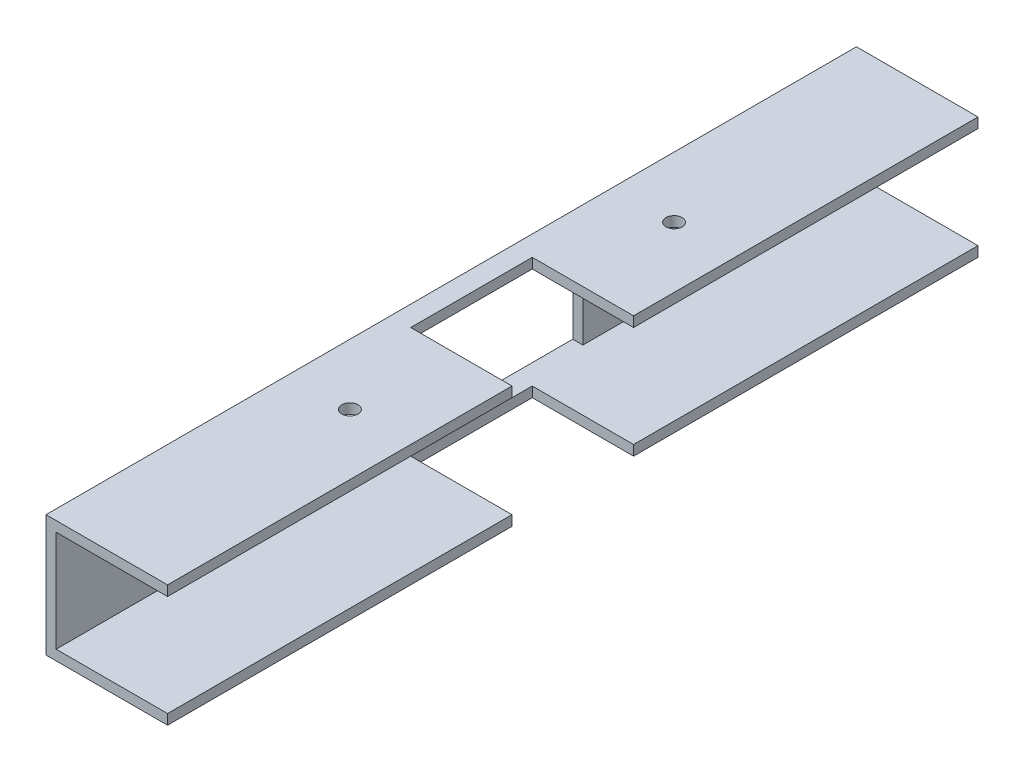
ISO-10303-21;
HEADER;
FILE_DESCRIPTION(('STEP AP214'),'2;1');
FILE_NAME('part.step','',(''),(''),'','','');
FILE_SCHEMA(('AUTOMOTIVE_DESIGN { 1 0 10303 214 1 1 1 1 }'));
ENDSEC;
DATA;
#1=APPLICATION_CONTEXT('core data for automotive mechanical design processes');
#2=APPLICATION_PROTOCOL_DEFINITION('international standard','automotive_design',2000,#1);
#3=PRODUCT_CONTEXT('',#1,'mechanical');
#4=PRODUCT('Part','Part','',(#3));
#5=PRODUCT_RELATED_PRODUCT_CATEGORY('part','',(#4));
#6=PRODUCT_DEFINITION_FORMATION('','',#4);
#7=PRODUCT_DEFINITION_CONTEXT('part definition',#1,'design');
#8=PRODUCT_DEFINITION('design','',#6,#7);
#9=PRODUCT_DEFINITION_SHAPE('','',#8);
#10=(LENGTH_UNIT() NAMED_UNIT(*) SI_UNIT(.MILLI.,.METRE.));
#11=(NAMED_UNIT(*) PLANE_ANGLE_UNIT() SI_UNIT($,.RADIAN.));
#12=(NAMED_UNIT(*) SI_UNIT($,.STERADIAN.) SOLID_ANGLE_UNIT());
#13=UNCERTAINTY_MEASURE_WITH_UNIT(LENGTH_MEASURE(1.E-05),#10,'distance_accuracy_value','');
#14=(GEOMETRIC_REPRESENTATION_CONTEXT(3) GLOBAL_UNCERTAINTY_ASSIGNED_CONTEXT((#13)) GLOBAL_UNIT_ASSIGNED_CONTEXT((#10,
#11,#12)) REPRESENTATION_CONTEXT('',''));
#15=CARTESIAN_POINT('',(0.,0.,0.));
#16=DIRECTION('',(0.,0.,1.));
#17=DIRECTION('',(1.,0.,0.));
#18=AXIS2_PLACEMENT_3D('',#15,#16,#17);
#19=CARTESIAN_POINT('',(19.05,15.875,127.));
#20=DIRECTION('',(0.,-1.,0.));
#21=DIRECTION('',(1.,0.,0.));
#22=AXIS2_PLACEMENT_3D('',#19,#20,#21);
#23=PLANE('',#22);
#24=DIRECTION('',(0.,0.,-1.));
#25=VECTOR('',#24,1.);
#26=CARTESIAN_POINT('',(-15.875,15.875,127.));
#27=LINE('',#26,#25);
#28=CARTESIAN_POINT('',(-15.875,15.875,127.));
#29=VERTEX_POINT('',#28);
#30=CARTESIAN_POINT('',(-15.875,15.875,38.1));
#31=VERTEX_POINT('',#30);
#32=EDGE_CURVE('E302',#29,#31,#27,.T.);
#33=ORIENTED_EDGE('',*,*,#32,.T.);
#34=DIRECTION('',(-1.,0.,0.));
#35=VECTOR('',#34,1.);
#36=CARTESIAN_POINT('',(19.05,15.875,38.1));
#37=LINE('',#36,#35);
#38=CARTESIAN_POINT('',(-19.05,15.875,38.1));
#39=VERTEX_POINT('',#38);
#40=EDGE_CURVE('E176',#31,#39,#37,.T.);
#41=ORIENTED_EDGE('',*,*,#40,.T.);
#42=DIRECTION('',(0.,0.,-1.));
#43=VECTOR('',#42,1.);
#44=CARTESIAN_POINT('',(-19.05,15.875,-38.1));
#45=LINE('',#44,#43);
#46=CARTESIAN_POINT('',(-19.05,15.875,-38.1));
#47=VERTEX_POINT('',#46);
#48=EDGE_CURVE('E188',#39,#47,#45,.T.);
#49=ORIENTED_EDGE('',*,*,#48,.T.);
#50=DIRECTION('',(-1.,0.,0.));
#51=VECTOR('',#50,1.);
#52=CARTESIAN_POINT('',(19.05,15.875,-38.1));
#53=LINE('',#52,#51);
#54=CARTESIAN_POINT('',(-15.875,15.875,-38.1));
#55=VERTEX_POINT('',#54);
#56=EDGE_CURVE('E193',#55,#47,#53,.T.);
#57=ORIENTED_EDGE('',*,*,#56,.F.);
#58=CARTESIAN_POINT('',(-15.875,15.875,-127.));
#59=VERTEX_POINT('',#58);
#60=EDGE_CURVE('E301',#55,#59,#27,.T.);
#61=ORIENTED_EDGE('',*,*,#60,.T.);
#62=DIRECTION('',(-1.,0.,0.));
#63=VECTOR('',#62,1.);
#64=CARTESIAN_POINT('',(19.05,15.875,-127.));
#65=LINE('',#64,#63);
#66=CARTESIAN_POINT('',(19.05,15.875,-127.));
#67=VERTEX_POINT('',#66);
#68=EDGE_CURVE('E280',#67,#59,#65,.T.);
#69=ORIENTED_EDGE('',*,*,#68,.F.);
#70=DIRECTION('',(0.,0.,-1.));
#71=VECTOR('',#70,1.);
#72=CARTESIAN_POINT('',(19.05,15.875,127.));
#73=LINE('',#72,#71);
#74=CARTESIAN_POINT('',(19.05,15.875,-19.05));
#75=VERTEX_POINT('',#74);
#76=EDGE_CURVE('E298',#75,#67,#73,.T.);
#77=ORIENTED_EDGE('',*,*,#76,.F.);
#78=DIRECTION('',(1.,0.,0.));
#79=VECTOR('',#78,1.);
#80=CARTESIAN_POINT('',(19.05,15.875,-19.05));
#81=LINE('',#80,#79);
#82=CARTESIAN_POINT('',(-12.7,15.875,-19.05));
#83=VERTEX_POINT('',#82);
#84=EDGE_CURVE('E221',#83,#75,#81,.T.);
#85=ORIENTED_EDGE('',*,*,#84,.F.);
#86=DIRECTION('',(0.,0.,-1.));
#87=VECTOR('',#86,1.);
#88=CARTESIAN_POINT('',(-12.7,15.875,127.));
#89=LINE('',#88,#87);
#90=CARTESIAN_POINT('',(-12.7,15.875,19.05));
#91=VERTEX_POINT('',#90);
#92=EDGE_CURVE('E236',#91,#83,#89,.T.);
#93=ORIENTED_EDGE('',*,*,#92,.F.);
#94=DIRECTION('',(-1.,0.,0.));
#95=VECTOR('',#94,1.);
#96=CARTESIAN_POINT('',(19.0499999999999,15.875,19.05));
#97=LINE('',#96,#95);
#98=CARTESIAN_POINT('',(19.05,15.875,19.05));
#99=VERTEX_POINT('',#98);
#100=EDGE_CURVE('E240',#99,#91,#97,.T.);
#101=ORIENTED_EDGE('',*,*,#100,.F.);
#102=CARTESIAN_POINT('',(19.05,15.875,127.));
#103=VERTEX_POINT('',#102);
#104=EDGE_CURVE('E299',#103,#99,#73,.T.);
#105=ORIENTED_EDGE('',*,*,#104,.F.);
#106=DIRECTION('',(-1.,0.,0.));
#107=VECTOR('',#106,1.);
#108=CARTESIAN_POINT('',(19.05,15.875,127.));
#109=LINE('',#108,#107);
#110=EDGE_CURVE('E258',#103,#29,#109,.T.);
#111=ORIENTED_EDGE('',*,*,#110,.T.);
#112=EDGE_LOOP('',(#33,#41,#49,#57,#61,#69,#77,#85,#93,#101,#105,#111));
#113=FACE_BOUND('',#112,.T.);
#114=CARTESIAN_POINT('',(0.,15.875,50.8));
#115=DIRECTION('',(0.,-1.,0.));
#116=DIRECTION('',(1.,0.,0.));
#117=AXIS2_PLACEMENT_3D('',#114,#115,#116);
#118=CIRCLE('',#117,2.54);
#119=CARTESIAN_POINT('',(2.54,15.875,50.8));
#120=VERTEX_POINT('',#119);
#121=EDGE_CURVE('E334',#120,#120,#118,.F.);
#122=ORIENTED_EDGE('',*,*,#121,.T.);
#123=EDGE_LOOP('',(#122));
#124=FACE_BOUND('',#123,.T.);
#125=CARTESIAN_POINT('',(0.,15.875,-50.8));
#126=DIRECTION('',(0.,-1.,0.));
#127=DIRECTION('',(1.,0.,0.));
#128=AXIS2_PLACEMENT_3D('',#125,#126,#127);
#129=CIRCLE('',#128,2.54);
#130=CARTESIAN_POINT('',(2.54,15.875,-50.8));
#131=VERTEX_POINT('',#130);
#132=EDGE_CURVE('E342',#131,#131,#129,.T.);
#133=ORIENTED_EDGE('',*,*,#132,.F.);
#134=EDGE_LOOP('',(#133));
#135=FACE_BOUND('',#134,.T.);
#136=ADVANCED_FACE('F33',(#113,#124,#135),#23,.T.);
#137=CARTESIAN_POINT('',(19.05,19.05,127.));
#138=DIRECTION('',(0.,-1.,0.));
#139=DIRECTION('',(1.,0.,0.));
#140=AXIS2_PLACEMENT_3D('',#137,#138,#139);
#141=PLANE('',#140);
#142=DIRECTION('',(0.,0.,-1.));
#143=VECTOR('',#142,1.);
#144=CARTESIAN_POINT('',(19.05,19.05,127.));
#145=LINE('',#144,#143);
#146=CARTESIAN_POINT('',(19.05,19.05,127.));
#147=VERTEX_POINT('',#146);
#148=CARTESIAN_POINT('',(19.05,19.05,19.05));
#149=VERTEX_POINT('',#148);
#150=EDGE_CURVE('E295',#147,#149,#145,.T.);
#151=ORIENTED_EDGE('',*,*,#150,.T.);
#152=DIRECTION('',(1.,0.,0.));
#153=VECTOR('',#152,1.);
#154=CARTESIAN_POINT('',(19.05,19.05,19.05));
#155=LINE('',#154,#153);
#156=CARTESIAN_POINT('',(-12.7,19.05,19.05));
#157=VERTEX_POINT('',#156);
#158=EDGE_CURVE('E205',#157,#149,#155,.T.);
#159=ORIENTED_EDGE('',*,*,#158,.F.);
#160=DIRECTION('',(0.,0.,1.));
#161=VECTOR('',#160,1.);
#162=CARTESIAN_POINT('',(-12.7,19.05,-19.05));
#163=LINE('',#162,#161);
#164=CARTESIAN_POINT('',(-12.7,19.05,-19.05));
#165=VERTEX_POINT('',#164);
#166=EDGE_CURVE('E214',#165,#157,#163,.T.);
#167=ORIENTED_EDGE('',*,*,#166,.F.);
#168=DIRECTION('',(-1.,0.,0.));
#169=VECTOR('',#168,1.);
#170=CARTESIAN_POINT('',(19.05,19.05,-19.05));
#171=LINE('',#170,#169);
#172=CARTESIAN_POINT('',(19.05,19.05,-19.05));
#173=VERTEX_POINT('',#172);
#174=EDGE_CURVE('E200',#173,#165,#171,.T.);
#175=ORIENTED_EDGE('',*,*,#174,.F.);
#176=CARTESIAN_POINT('',(19.05,19.05,-127.));
#177=VERTEX_POINT('',#176);
#178=EDGE_CURVE('E294',#173,#177,#145,.T.);
#179=ORIENTED_EDGE('',*,*,#178,.T.);
#180=DIRECTION('',(-1.,0.,0.));
#181=VECTOR('',#180,1.);
#182=CARTESIAN_POINT('',(19.05,19.05,-127.));
#183=LINE('',#182,#181);
#184=CARTESIAN_POINT('',(-19.05,19.05,-127.));
#185=VERTEX_POINT('',#184);
#186=EDGE_CURVE('E286',#177,#185,#183,.T.);
#187=ORIENTED_EDGE('',*,*,#186,.T.);
#188=DIRECTION('',(0.,0.,-1.));
#189=VECTOR('',#188,1.);
#190=CARTESIAN_POINT('',(-19.05,19.05,127.));
#191=LINE('',#190,#189);
#192=CARTESIAN_POINT('',(-19.05,19.05,127.));
#193=VERTEX_POINT('',#192);
#194=EDGE_CURVE('E291',#193,#185,#191,.T.);
#195=ORIENTED_EDGE('',*,*,#194,.F.);
#196=DIRECTION('',(-1.,0.,0.));
#197=VECTOR('',#196,1.);
#198=CARTESIAN_POINT('',(19.05,19.05,127.));
#199=LINE('',#198,#197);
#200=EDGE_CURVE('E264',#147,#193,#199,.T.);
#201=ORIENTED_EDGE('',*,*,#200,.F.);
#202=EDGE_LOOP('',(#151,#159,#167,#175,#179,#187,#195,#201));
#203=FACE_BOUND('',#202,.T.);
#204=CARTESIAN_POINT('',(0.,19.05,50.8));
#205=DIRECTION('',(0.,1.,0.));
#206=DIRECTION('',(-1.,0.,0.));
#207=AXIS2_PLACEMENT_3D('',#204,#205,#206);
#208=CIRCLE('',#207,2.54);
#209=CARTESIAN_POINT('',(-2.54,19.05,50.8));
#210=VERTEX_POINT('',#209);
#211=EDGE_CURVE('E332',#210,#210,#208,.T.);
#212=ORIENTED_EDGE('',*,*,#211,.F.);
#213=EDGE_LOOP('',(#212));
#214=FACE_BOUND('',#213,.T.);
#215=CARTESIAN_POINT('',(0.,19.05,-50.8));
#216=DIRECTION('',(0.,-1.,0.));
#217=DIRECTION('',(-1.,0.,0.));
#218=AXIS2_PLACEMENT_3D('',#215,#216,#217);
#219=CIRCLE('',#218,2.54);
#220=CARTESIAN_POINT('',(-2.54,19.05,-50.8));
#221=VERTEX_POINT('',#220);
#222=EDGE_CURVE('E338',#221,#221,#219,.T.);
#223=ORIENTED_EDGE('',*,*,#222,.T.);
#224=EDGE_LOOP('',(#223));
#225=FACE_BOUND('',#224,.T.);
#226=ADVANCED_FACE('F350',(#203,#214,#225),#141,.F.);
#227=CARTESIAN_POINT('',(-15.875,15.875,127.));
#228=DIRECTION('',(1.,0.,0.));
#229=DIRECTION('',(0.,1.,0.));
#230=AXIS2_PLACEMENT_3D('',#227,#228,#229);
#231=PLANE('',#230);
#232=DIRECTION('',(0.,1.,0.));
#233=VECTOR('',#232,1.);
#234=CARTESIAN_POINT('',(-15.875,15.875,-38.1));
#235=LINE('',#234,#233);
#236=CARTESIAN_POINT('',(-15.875,-15.875,-38.1));
#237=VERTEX_POINT('',#236);
#238=EDGE_CURVE('E198',#237,#55,#235,.T.);
#239=ORIENTED_EDGE('',*,*,#238,.F.);
#240=DIRECTION('',(0.,0.,-1.));
#241=VECTOR('',#240,1.);
#242=CARTESIAN_POINT('',(-15.875,-15.875,127.));
#243=LINE('',#242,#241);
#244=CARTESIAN_POINT('',(-15.875,-15.875,-127.));
#245=VERTEX_POINT('',#244);
#246=EDGE_CURVE('E305',#237,#245,#243,.T.);
#247=ORIENTED_EDGE('',*,*,#246,.T.);
#248=DIRECTION('',(0.,-1.,0.));
#249=VECTOR('',#248,1.);
#250=CARTESIAN_POINT('',(-15.875,15.875,-127.));
#251=LINE('',#250,#249);
#252=EDGE_CURVE('E277',#59,#245,#251,.T.);
#253=ORIENTED_EDGE('',*,*,#252,.F.);
#254=ORIENTED_EDGE('',*,*,#60,.F.);
#255=EDGE_LOOP('',(#239,#247,#253,#254));
#256=FACE_BOUND('',#255,.T.);
#257=ADVANCED_FACE('F327',(#256),#231,.T.);
#258=CARTESIAN_POINT('',(19.05,-15.875,127.));
#259=DIRECTION('',(1.,0.,0.));
#260=DIRECTION('',(0.,0.,-1.));
#261=AXIS2_PLACEMENT_3D('',#258,#259,#260);
#262=PLANE('',#261);
#263=DIRECTION('',(0.,1.,0.));
#264=VECTOR('',#263,1.);
#265=CARTESIAN_POINT('',(19.05,-19.05,19.05));
#266=LINE('',#265,#264);
#267=CARTESIAN_POINT('',(19.05,-19.05,19.05));
#268=VERTEX_POINT('',#267);
#269=CARTESIAN_POINT('',(19.05,-15.875,19.05));
#270=VERTEX_POINT('',#269);
#271=EDGE_CURVE('E218',#268,#270,#266,.T.);
#272=ORIENTED_EDGE('',*,*,#271,.T.);
#273=DIRECTION('',(0.,0.,-1.));
#274=VECTOR('',#273,1.);
#275=CARTESIAN_POINT('',(19.05,-15.875,127.));
#276=LINE('',#275,#274);
#277=CARTESIAN_POINT('',(19.05,-15.875,127.));
#278=VERTEX_POINT('',#277);
#279=EDGE_CURVE('E308',#278,#270,#276,.T.);
#280=ORIENTED_EDGE('',*,*,#279,.F.);
#281=DIRECTION('',(0.,-1.,0.));
#282=VECTOR('',#281,1.);
#283=CARTESIAN_POINT('',(19.05,-15.875,127.));
#284=LINE('',#283,#282);
#285=CARTESIAN_POINT('',(19.05,-19.05,127.));
#286=VERTEX_POINT('',#285);
#287=EDGE_CURVE('E248',#278,#286,#284,.T.);
#288=ORIENTED_EDGE('',*,*,#287,.T.);
#289=DIRECTION('',(0.,0.,-1.));
#290=VECTOR('',#289,1.);
#291=CARTESIAN_POINT('',(19.05,-19.05,127.));
#292=LINE('',#291,#290);
#293=EDGE_CURVE('E11',#286,#268,#292,.T.);
#294=ORIENTED_EDGE('',*,*,#293,.T.);
#295=EDGE_LOOP('',(#272,#280,#288,#294));
#296=FACE_BOUND('',#295,.T.);
#297=ADVANCED_FACE('F367',(#296),#262,.T.);
#298=CARTESIAN_POINT('',(19.05,19.05,127.));
#299=DIRECTION('',(1.,0.,0.));
#300=DIRECTION('',(0.,0.,-1.));
#301=AXIS2_PLACEMENT_3D('',#298,#299,#300);
#302=PLANE('',#301);
#303=EDGE_CURVE('E222',#99,#149,#266,.T.);
#304=ORIENTED_EDGE('',*,*,#303,.T.);
#305=ORIENTED_EDGE('',*,*,#150,.F.);
#306=DIRECTION('',(0.,-1.,0.));
#307=VECTOR('',#306,1.);
#308=CARTESIAN_POINT('',(19.05,19.05,127.));
#309=LINE('',#308,#307);
#310=EDGE_CURVE('E261',#147,#103,#309,.T.);
#311=ORIENTED_EDGE('',*,*,#310,.T.);
#312=ORIENTED_EDGE('',*,*,#104,.T.);
#313=EDGE_LOOP('',(#304,#305,#311,#312));
#314=FACE_BOUND('',#313,.T.);
#315=ADVANCED_FACE('F373',(#314),#302,.T.);
#316=CARTESIAN_POINT('',(-19.05,-19.05,127.));
#317=DIRECTION('',(0.,1.,0.));
#318=DIRECTION('',(0.,0.,1.));
#319=AXIS2_PLACEMENT_3D('',#316,#317,#318);
#320=PLANE('',#319);
#321=DIRECTION('',(0.,0.,1.));
#322=VECTOR('',#321,1.);
#323=CARTESIAN_POINT('',(-12.7,-19.05,-19.05));
#324=LINE('',#323,#322);
#325=CARTESIAN_POINT('',(-12.7,-19.05,-19.05));
#326=VERTEX_POINT('',#325);
#327=CARTESIAN_POINT('',(-12.7,-19.05,19.05));
#328=VERTEX_POINT('',#327);
#329=EDGE_CURVE('E204',#326,#328,#324,.T.);
#330=ORIENTED_EDGE('',*,*,#329,.T.);
#331=DIRECTION('',(1.,0.,0.));
#332=VECTOR('',#331,1.);
#333=CARTESIAN_POINT('',(19.05,-19.05,19.05));
#334=LINE('',#333,#332);
#335=EDGE_CURVE('E208',#328,#268,#334,.T.);
#336=ORIENTED_EDGE('',*,*,#335,.T.);
#337=ORIENTED_EDGE('',*,*,#293,.F.);
#338=DIRECTION('',(1.,0.,0.));
#339=VECTOR('',#338,1.);
#340=CARTESIAN_POINT('',(-19.05,-19.05,127.));
#341=LINE('',#340,#339);
#342=CARTESIAN_POINT('',(-19.05,-19.05,127.));
#343=VERTEX_POINT('',#342);
#344=EDGE_CURVE('E246',#343,#286,#341,.T.);
#345=ORIENTED_EDGE('',*,*,#344,.F.);
#346=DIRECTION('',(0.,0.,-1.));
#347=VECTOR('',#346,1.);
#348=CARTESIAN_POINT('',(-19.05,-19.05,127.));
#349=LINE('',#348,#347);
#350=CARTESIAN_POINT('',(-19.05,-19.05,-127.));
#351=VERTEX_POINT('',#350);
#352=EDGE_CURVE('E268',#343,#351,#349,.T.);
#353=ORIENTED_EDGE('',*,*,#352,.T.);
#354=DIRECTION('',(1.,0.,0.));
#355=VECTOR('',#354,1.);
#356=CARTESIAN_POINT('',(-19.05,-19.05,-127.));
#357=LINE('',#356,#355);
#358=CARTESIAN_POINT('',(19.05,-19.05,-127.));
#359=VERTEX_POINT('',#358);
#360=EDGE_CURVE('E245',#351,#359,#357,.T.);
#361=ORIENTED_EDGE('',*,*,#360,.T.);
#362=CARTESIAN_POINT('',(19.05,-19.05,-19.05));
#363=VERTEX_POINT('',#362);
#364=EDGE_CURVE('E41',#363,#359,#292,.T.);
#365=ORIENTED_EDGE('',*,*,#364,.F.);
#366=DIRECTION('',(-1.,0.,0.));
#367=VECTOR('',#366,1.);
#368=CARTESIAN_POINT('',(19.05,-19.05,-19.05));
#369=LINE('',#368,#367);
#370=EDGE_CURVE('E201',#363,#326,#369,.T.);
#371=ORIENTED_EDGE('',*,*,#370,.T.);
#372=EDGE_LOOP('',(#330,#336,#337,#345,#353,#361,#365,#371));
#373=FACE_BOUND('',#372,.T.);
#374=ADVANCED_FACE('F35',(#373),#320,.F.);
#375=DIRECTION('',(0.,1.,0.));
#376=VECTOR('',#375,1.);
#377=CARTESIAN_POINT('',(19.05,-19.05,-19.05));
#378=LINE('',#377,#376);
#379=CARTESIAN_POINT('',(19.05,-15.875,-19.05));
#380=VERTEX_POINT('',#379);
#381=EDGE_CURVE('E231',#363,#380,#378,.T.);
#382=ORIENTED_EDGE('',*,*,#381,.F.);
#383=ORIENTED_EDGE('',*,*,#364,.T.);
#384=DIRECTION('',(0.,-1.,0.));
#385=VECTOR('',#384,1.);
#386=CARTESIAN_POINT('',(19.05,-15.875,-127.));
#387=LINE('',#386,#385);
#388=CARTESIAN_POINT('',(19.05,-15.875,-127.));
#389=VERTEX_POINT('',#388);
#390=EDGE_CURVE('E271',#389,#359,#387,.T.);
#391=ORIENTED_EDGE('',*,*,#390,.F.);
#392=EDGE_CURVE('E307',#380,#389,#276,.T.);
#393=ORIENTED_EDGE('',*,*,#392,.F.);
#394=EDGE_LOOP('',(#382,#383,#391,#393));
#395=FACE_BOUND('',#394,.T.);
#396=ADVANCED_FACE('F317',(#395),#262,.T.);
#397=CARTESIAN_POINT('',(-15.875,-15.875,127.));
#398=DIRECTION('',(0.,1.,0.));
#399=DIRECTION('',(0.,0.,1.));
#400=AXIS2_PLACEMENT_3D('',#397,#398,#399);
#401=PLANE('',#400);
#402=ORIENTED_EDGE('',*,*,#279,.T.);
#403=DIRECTION('',(1.,0.,0.));
#404=VECTOR('',#403,1.);
#405=CARTESIAN_POINT('',(-15.8750000000001,-15.875,19.05));
#406=LINE('',#405,#404);
#407=CARTESIAN_POINT('',(-12.7,-15.875,19.05));
#408=VERTEX_POINT('',#407);
#409=EDGE_CURVE('E242',#408,#270,#406,.T.);
#410=ORIENTED_EDGE('',*,*,#409,.F.);
#411=DIRECTION('',(0.,0.,1.));
#412=VECTOR('',#411,1.);
#413=CARTESIAN_POINT('',(-12.7,-15.875,127.));
#414=LINE('',#413,#412);
#415=CARTESIAN_POINT('',(-12.7,-15.875,-19.05));
#416=VERTEX_POINT('',#415);
#417=EDGE_CURVE('E238',#416,#408,#414,.T.);
#418=ORIENTED_EDGE('',*,*,#417,.F.);
#419=DIRECTION('',(-1.,0.,0.));
#420=VECTOR('',#419,1.);
#421=CARTESIAN_POINT('',(-15.875,-15.875,-19.05));
#422=LINE('',#421,#420);
#423=EDGE_CURVE('E234',#380,#416,#422,.T.);
#424=ORIENTED_EDGE('',*,*,#423,.F.);
#425=ORIENTED_EDGE('',*,*,#392,.T.);
#426=DIRECTION('',(1.,0.,0.));
#427=VECTOR('',#426,1.);
#428=CARTESIAN_POINT('',(-15.875,-15.875,-127.));
#429=LINE('',#428,#427);
#430=EDGE_CURVE('E274',#245,#389,#429,.T.);
#431=ORIENTED_EDGE('',*,*,#430,.F.);
#432=ORIENTED_EDGE('',*,*,#246,.F.);
#433=DIRECTION('',(-1.,0.,0.));
#434=VECTOR('',#433,1.);
#435=CARTESIAN_POINT('',(19.05,-15.875,-38.1));
#436=LINE('',#435,#434);
#437=CARTESIAN_POINT('',(-19.05,-15.875,-38.1));
#438=VERTEX_POINT('',#437);
#439=EDGE_CURVE('E177',#237,#438,#436,.T.);
#440=ORIENTED_EDGE('',*,*,#439,.T.);
#441=DIRECTION('',(0.,0.,1.));
#442=VECTOR('',#441,1.);
#443=CARTESIAN_POINT('',(-19.05,-15.875,-38.1));
#444=LINE('',#443,#442);
#445=CARTESIAN_POINT('',(-19.05,-15.875,38.1));
#446=VERTEX_POINT('',#445);
#447=EDGE_CURVE('E180',#438,#446,#444,.T.);
#448=ORIENTED_EDGE('',*,*,#447,.T.);
#449=DIRECTION('',(-1.,0.,0.));
#450=VECTOR('',#449,1.);
#451=CARTESIAN_POINT('',(19.05,-15.875,38.1));
#452=LINE('',#451,#450);
#453=CARTESIAN_POINT('',(-15.875,-15.875,38.1));
#454=VERTEX_POINT('',#453);
#455=EDGE_CURVE('E48',#454,#446,#452,.T.);
#456=ORIENTED_EDGE('',*,*,#455,.F.);
#457=CARTESIAN_POINT('',(-15.875,-15.875,127.));
#458=VERTEX_POINT('',#457);
#459=EDGE_CURVE('E306',#458,#454,#243,.T.);
#460=ORIENTED_EDGE('',*,*,#459,.F.);
#461=DIRECTION('',(1.,0.,0.));
#462=VECTOR('',#461,1.);
#463=CARTESIAN_POINT('',(-15.875,-15.875,127.));
#464=LINE('',#463,#462);
#465=EDGE_CURVE('E252',#458,#278,#464,.T.);
#466=ORIENTED_EDGE('',*,*,#465,.T.);
#467=EDGE_LOOP('',(#402,#410,#418,#424,#425,#431,#432,#440,#448,#456,#460,#466));
#468=FACE_BOUND('',#467,.T.);
#469=ADVANCED_FACE('F181',(#468),#401,.T.);
#470=DIRECTION('',(0.,-1.,0.));
#471=VECTOR('',#470,1.);
#472=CARTESIAN_POINT('',(-15.875,15.875,38.1));
#473=LINE('',#472,#471);
#474=EDGE_CURVE('E174',#31,#454,#473,.T.);
#475=ORIENTED_EDGE('',*,*,#474,.F.);
#476=ORIENTED_EDGE('',*,*,#32,.F.);
#477=DIRECTION('',(0.,-1.,0.));
#478=VECTOR('',#477,1.);
#479=CARTESIAN_POINT('',(-15.875,15.875,127.));
#480=LINE('',#479,#478);
#481=EDGE_CURVE('E255',#29,#458,#480,.T.);
#482=ORIENTED_EDGE('',*,*,#481,.T.);
#483=ORIENTED_EDGE('',*,*,#459,.T.);
#484=EDGE_LOOP('',(#475,#476,#482,#483));
#485=FACE_BOUND('',#484,.T.);
#486=ADVANCED_FACE('F362',(#485),#231,.T.);
#487=EDGE_CURVE('E211',#75,#173,#378,.T.);
#488=ORIENTED_EDGE('',*,*,#487,.F.);
#489=ORIENTED_EDGE('',*,*,#76,.T.);
#490=DIRECTION('',(0.,-1.,0.));
#491=VECTOR('',#490,1.);
#492=CARTESIAN_POINT('',(19.05,19.05,-127.));
#493=LINE('',#492,#491);
#494=EDGE_CURVE('E283',#177,#67,#493,.T.);
#495=ORIENTED_EDGE('',*,*,#494,.F.);
#496=ORIENTED_EDGE('',*,*,#178,.F.);
#497=EDGE_LOOP('',(#488,#489,#495,#496));
#498=FACE_BOUND('',#497,.T.);
#499=ADVANCED_FACE('F361',(#498),#302,.T.);
#500=CARTESIAN_POINT('',(-19.05,19.05,127.));
#501=DIRECTION('',(1.,0.,0.));
#502=DIRECTION('',(0.,1.,0.));
#503=AXIS2_PLACEMENT_3D('',#500,#501,#502);
#504=PLANE('',#503);
#505=ORIENTED_EDGE('',*,*,#447,.F.);
#506=DIRECTION('',(0.,-1.,0.));
#507=VECTOR('',#506,1.);
#508=CARTESIAN_POINT('',(-19.05,15.875,-38.1));
#509=LINE('',#508,#507);
#510=EDGE_CURVE('E56',#47,#438,#509,.T.);
#511=ORIENTED_EDGE('',*,*,#510,.F.);
#512=ORIENTED_EDGE('',*,*,#48,.F.);
#513=DIRECTION('',(0.,1.,0.));
#514=VECTOR('',#513,1.);
#515=CARTESIAN_POINT('',(-19.05,15.875,38.1));
#516=LINE('',#515,#514);
#517=EDGE_CURVE('E171',#446,#39,#516,.T.);
#518=ORIENTED_EDGE('',*,*,#517,.F.);
#519=EDGE_LOOP('',(#505,#511,#512,#518));
#520=FACE_BOUND('',#519,.T.);
#521=DIRECTION('',(0.,-1.,0.));
#522=VECTOR('',#521,1.);
#523=CARTESIAN_POINT('',(-19.05,19.05,-127.));
#524=LINE('',#523,#522);
#525=EDGE_CURVE('E249',#185,#351,#524,.T.);
#526=ORIENTED_EDGE('',*,*,#525,.T.);
#527=ORIENTED_EDGE('',*,*,#352,.F.);
#528=DIRECTION('',(0.,-1.,0.));
#529=VECTOR('',#528,1.);
#530=CARTESIAN_POINT('',(-19.05,19.05,127.));
#531=LINE('',#530,#529);
#532=EDGE_CURVE('E266',#193,#343,#531,.T.);
#533=ORIENTED_EDGE('',*,*,#532,.F.);
#534=ORIENTED_EDGE('',*,*,#194,.T.);
#535=EDGE_LOOP('',(#526,#527,#533,#534));
#536=FACE_BOUND('',#535,.T.);
#537=ADVANCED_FACE('F185',(#520,#536),#504,.F.);
#538=CARTESIAN_POINT('',(0.,0.,127.));
#539=DIRECTION('',(0.,0.,-1.));
#540=DIRECTION('',(-1.,0.,0.));
#541=AXIS2_PLACEMENT_3D('',#538,#539,#540);
#542=PLANE('',#541);
#543=ORIENTED_EDGE('',*,*,#344,.T.);
#544=ORIENTED_EDGE('',*,*,#287,.F.);
#545=ORIENTED_EDGE('',*,*,#465,.F.);
#546=ORIENTED_EDGE('',*,*,#481,.F.);
#547=ORIENTED_EDGE('',*,*,#110,.F.);
#548=ORIENTED_EDGE('',*,*,#310,.F.);
#549=ORIENTED_EDGE('',*,*,#200,.T.);
#550=ORIENTED_EDGE('',*,*,#532,.T.);
#551=EDGE_LOOP('',(#543,#544,#545,#546,#547,#548,#549,#550));
#552=FACE_BOUND('',#551,.T.);
#553=ADVANCED_FACE('F424',(#552),#542,.F.);
#554=CARTESIAN_POINT('',(0.,0.,-127.));
#555=DIRECTION('',(0.,0.,-1.));
#556=DIRECTION('',(-1.,0.,0.));
#557=AXIS2_PLACEMENT_3D('',#554,#555,#556);
#558=PLANE('',#557);
#559=ORIENTED_EDGE('',*,*,#360,.F.);
#560=ORIENTED_EDGE('',*,*,#525,.F.);
#561=ORIENTED_EDGE('',*,*,#186,.F.);
#562=ORIENTED_EDGE('',*,*,#494,.T.);
#563=ORIENTED_EDGE('',*,*,#68,.T.);
#564=ORIENTED_EDGE('',*,*,#252,.T.);
#565=ORIENTED_EDGE('',*,*,#430,.T.);
#566=ORIENTED_EDGE('',*,*,#390,.T.);
#567=EDGE_LOOP('',(#559,#560,#561,#562,#563,#564,#565,#566));
#568=FACE_BOUND('',#567,.T.);
#569=ADVANCED_FACE('F321',(#568),#558,.T.);
#570=CARTESIAN_POINT('',(19.05,-19.05,-19.05));
#571=DIRECTION('',(0.,0.,-1.));
#572=DIRECTION('',(-1.,0.,0.));
#573=AXIS2_PLACEMENT_3D('',#570,#571,#572);
#574=PLANE('',#573);
#575=ORIENTED_EDGE('',*,*,#84,.T.);
#576=ORIENTED_EDGE('',*,*,#487,.T.);
#577=ORIENTED_EDGE('',*,*,#174,.T.);
#578=DIRECTION('',(0.,1.,0.));
#579=VECTOR('',#578,1.);
#580=CARTESIAN_POINT('',(-12.7,-19.05,-19.05));
#581=LINE('',#580,#579);
#582=EDGE_CURVE('E230',#83,#165,#581,.T.);
#583=ORIENTED_EDGE('',*,*,#582,.F.);
#584=EDGE_LOOP('',(#575,#576,#577,#583));
#585=FACE_BOUND('',#584,.T.);
#586=ADVANCED_FACE('F412',(#585),#574,.F.);
#587=CARTESIAN_POINT('',(-12.7,-19.05,-19.05));
#588=DIRECTION('',(-1.,0.,0.));
#589=DIRECTION('',(0.,0.,1.));
#590=AXIS2_PLACEMENT_3D('',#587,#588,#589);
#591=PLANE('',#590);
#592=ORIENTED_EDGE('',*,*,#92,.T.);
#593=ORIENTED_EDGE('',*,*,#582,.T.);
#594=ORIENTED_EDGE('',*,*,#166,.T.);
#595=DIRECTION('',(0.,1.,0.));
#596=VECTOR('',#595,1.);
#597=CARTESIAN_POINT('',(-12.7,-19.05,19.05));
#598=LINE('',#597,#596);
#599=EDGE_CURVE('E226',#91,#157,#598,.T.);
#600=ORIENTED_EDGE('',*,*,#599,.F.);
#601=EDGE_LOOP('',(#592,#593,#594,#600));
#602=FACE_BOUND('',#601,.T.);
#603=ADVANCED_FACE('F414',(#602),#591,.F.);
#604=CARTESIAN_POINT('',(19.05,-19.05,19.05));
#605=DIRECTION('',(0.,0.,1.));
#606=DIRECTION('',(1.,0.,0.));
#607=AXIS2_PLACEMENT_3D('',#604,#605,#606);
#608=PLANE('',#607);
#609=ORIENTED_EDGE('',*,*,#100,.T.);
#610=ORIENTED_EDGE('',*,*,#599,.T.);
#611=ORIENTED_EDGE('',*,*,#158,.T.);
#612=ORIENTED_EDGE('',*,*,#303,.F.);
#613=EDGE_LOOP('',(#609,#610,#611,#612));
#614=FACE_BOUND('',#613,.T.);
#615=ADVANCED_FACE('F418',(#614),#608,.F.);
#616=ORIENTED_EDGE('',*,*,#409,.T.);
#617=ORIENTED_EDGE('',*,*,#271,.F.);
#618=ORIENTED_EDGE('',*,*,#335,.F.);
#619=EDGE_CURVE('E223',#328,#408,#598,.T.);
#620=ORIENTED_EDGE('',*,*,#619,.T.);
#621=EDGE_LOOP('',(#616,#617,#618,#620));
#622=FACE_BOUND('',#621,.T.);
#623=ADVANCED_FACE('F385',(#622),#608,.F.);
#624=ORIENTED_EDGE('',*,*,#417,.T.);
#625=ORIENTED_EDGE('',*,*,#619,.F.);
#626=ORIENTED_EDGE('',*,*,#329,.F.);
#627=EDGE_CURVE('E227',#326,#416,#581,.T.);
#628=ORIENTED_EDGE('',*,*,#627,.T.);
#629=EDGE_LOOP('',(#624,#625,#626,#628));
#630=FACE_BOUND('',#629,.T.);
#631=ADVANCED_FACE('F389',(#630),#591,.F.);
#632=ORIENTED_EDGE('',*,*,#423,.T.);
#633=ORIENTED_EDGE('',*,*,#627,.F.);
#634=ORIENTED_EDGE('',*,*,#370,.F.);
#635=ORIENTED_EDGE('',*,*,#381,.T.);
#636=EDGE_LOOP('',(#632,#633,#634,#635));
#637=FACE_BOUND('',#636,.T.);
#638=ADVANCED_FACE('F391',(#637),#574,.F.);
#639=CARTESIAN_POINT('',(19.05,15.875,-38.1));
#640=DIRECTION('',(0.,0.,-1.));
#641=DIRECTION('',(0.,1.,0.));
#642=AXIS2_PLACEMENT_3D('',#639,#640,#641);
#643=PLANE('',#642);
#644=ORIENTED_EDGE('',*,*,#238,.T.);
#645=ORIENTED_EDGE('',*,*,#56,.T.);
#646=ORIENTED_EDGE('',*,*,#510,.T.);
#647=ORIENTED_EDGE('',*,*,#439,.F.);
#648=EDGE_LOOP('',(#644,#645,#646,#647));
#649=FACE_BOUND('',#648,.T.);
#650=ADVANCED_FACE('F329',(#649),#643,.F.);
#651=CARTESIAN_POINT('',(19.05,15.875,38.1));
#652=DIRECTION('',(0.,0.,1.));
#653=DIRECTION('',(0.,-1.,0.));
#654=AXIS2_PLACEMENT_3D('',#651,#652,#653);
#655=PLANE('',#654);
#656=ORIENTED_EDGE('',*,*,#474,.T.);
#657=ORIENTED_EDGE('',*,*,#455,.T.);
#658=ORIENTED_EDGE('',*,*,#517,.T.);
#659=ORIENTED_EDGE('',*,*,#40,.F.);
#660=EDGE_LOOP('',(#656,#657,#658,#659));
#661=FACE_BOUND('',#660,.T.);
#662=ADVANCED_FACE('F169',(#661),#655,.F.);
#663=CARTESIAN_POINT('',(0.,-19.051,50.8));
#664=DIRECTION('',(0.,1.,0.));
#665=DIRECTION('',(-1.,0.,0.));
#666=AXIS2_PLACEMENT_3D('',#663,#664,#665);
#667=CYLINDRICAL_SURFACE('',#666,2.54);
#668=ORIENTED_EDGE('',*,*,#121,.F.);
#669=EDGE_LOOP('',(#668));
#670=FACE_BOUND('',#669,.T.);
#671=ORIENTED_EDGE('',*,*,#211,.T.);
#672=EDGE_LOOP('',(#671));
#673=FACE_BOUND('',#672,.T.);
#674=ADVANCED_FACE('F446',(#670,#673),#667,.F.);
#675=CARTESIAN_POINT('',(0.,-19.051,-50.8));
#676=DIRECTION('',(0.,1.,0.));
#677=DIRECTION('',(-1.,0.,0.));
#678=AXIS2_PLACEMENT_3D('',#675,#676,#677);
#679=CYLINDRICAL_SURFACE('',#678,2.54);
#680=ORIENTED_EDGE('',*,*,#132,.T.);
#681=EDGE_LOOP('',(#680));
#682=FACE_BOUND('',#681,.T.);
#683=ORIENTED_EDGE('',*,*,#222,.F.);
#684=EDGE_LOOP('',(#683));
#685=FACE_BOUND('',#684,.T.);
#686=ADVANCED_FACE('F346',(#682,#685),#679,.F.);
#687=CLOSED_SHELL('',(#136,#226,#257,#297,#315,#374,#396,#469,#486,#499,#537,#553,#569,#586,
#603,#615,#623,#631,#638,#650,#662,#674,#686));
#688=MANIFOLD_SOLID_BREP('B2',#687);
#689=ADVANCED_BREP_SHAPE_REPRESENTATION('',(#18,#688),#14);
#690=SHAPE_DEFINITION_REPRESENTATION(#9,#689);
ENDSEC;
END-ISO-10303-21;
